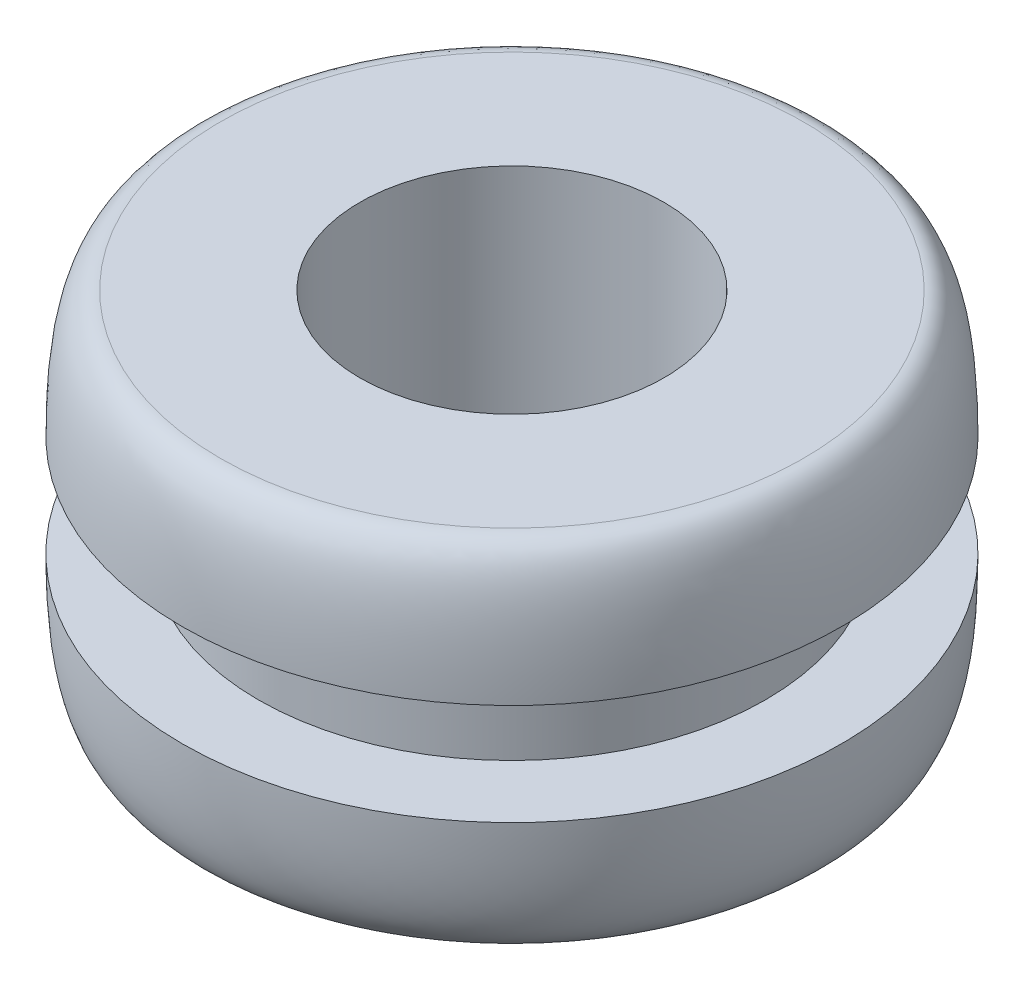
ISO-10303-21;
HEADER;
FILE_DESCRIPTION(('STEP AP214'),'2;1');
FILE_NAME('part.step','',(''),(''),'','','');
FILE_SCHEMA(('AUTOMOTIVE_DESIGN { 1 0 10303 214 1 1 1 1 }'));
ENDSEC;
DATA;
#1=APPLICATION_CONTEXT('core data for automotive mechanical design processes');
#2=APPLICATION_PROTOCOL_DEFINITION('international standard','automotive_design',2000,#1);
#3=PRODUCT_CONTEXT('',#1,'mechanical');
#4=PRODUCT('Part','Part','',(#3));
#5=PRODUCT_RELATED_PRODUCT_CATEGORY('part','',(#4));
#6=PRODUCT_DEFINITION_FORMATION('','',#4);
#7=PRODUCT_DEFINITION_CONTEXT('part definition',#1,'design');
#8=PRODUCT_DEFINITION('design','',#6,#7);
#9=PRODUCT_DEFINITION_SHAPE('','',#8);
#10=(LENGTH_UNIT() NAMED_UNIT(*) SI_UNIT(.MILLI.,.METRE.));
#11=(NAMED_UNIT(*) PLANE_ANGLE_UNIT() SI_UNIT($,.RADIAN.));
#12=(NAMED_UNIT(*) SI_UNIT($,.STERADIAN.) SOLID_ANGLE_UNIT());
#13=UNCERTAINTY_MEASURE_WITH_UNIT(LENGTH_MEASURE(1.E-05),#10,'distance_accuracy_value','');
#14=(GEOMETRIC_REPRESENTATION_CONTEXT(3) GLOBAL_UNCERTAINTY_ASSIGNED_CONTEXT((#13)) GLOBAL_UNIT_ASSIGNED_CONTEXT((#10,
#11,#12)) REPRESENTATION_CONTEXT('',''));
#15=CARTESIAN_POINT('',(0.,0.,0.));
#16=DIRECTION('',(0.,0.,1.));
#17=DIRECTION('',(1.,0.,0.));
#18=AXIS2_PLACEMENT_3D('',#15,#16,#17);
#19=CARTESIAN_POINT('',(-2.38125,2.778125,0.));
#20=DIRECTION('',(0.,1.,0.));
#21=DIRECTION('',(0.,0.,1.));
#22=AXIS2_PLACEMENT_3D('',#19,#20,#21);
#23=PLANE('',#22);
#24=CARTESIAN_POINT('',(0.,2.77812499999999,0.));
#25=DIRECTION('',(0.,1.,0.));
#26=DIRECTION('',(0.,0.,1.));
#27=AXIS2_PLACEMENT_3D('',#24,#25,#26);
#28=CIRCLE('',#27,4.5640625);
#29=CARTESIAN_POINT('',(0.,2.77812499999999,4.5640625));
#30=VERTEX_POINT('',#29);
#31=EDGE_CURVE('E63',#30,#30,#28,.T.);
#32=ORIENTED_EDGE('',*,*,#31,.T.);
#33=EDGE_LOOP('',(#32));
#34=FACE_BOUND('',#33,.T.);
#35=CARTESIAN_POINT('',(0.,2.77812500000001,0.));
#36=DIRECTION('',(0.,1.,0.));
#37=DIRECTION('',(0.,0.,1.));
#38=AXIS2_PLACEMENT_3D('',#35,#36,#37);
#39=CIRCLE('',#38,2.38125);
#40=CARTESIAN_POINT('',(0.,2.77812500000001,2.38125));
#41=VERTEX_POINT('',#40);
#42=EDGE_CURVE('E10',#41,#41,#39,.T.);
#43=ORIENTED_EDGE('',*,*,#42,.F.);
#44=EDGE_LOOP('',(#43));
#45=FACE_BOUND('',#44,.T.);
#46=ADVANCED_FACE('F35',(#34,#45),#23,.T.);
#47=CARTESIAN_POINT('',(0.,96.2646314073627,0.));
#48=DIRECTION('',(0.,1.,0.));
#49=DIRECTION('',(0.,0.,1.));
#50=AXIS2_PLACEMENT_3D('',#47,#48,#49);
#51=CYLINDRICAL_SURFACE('',#50,2.38125);
#52=ORIENTED_EDGE('',*,*,#42,.T.);
#53=EDGE_LOOP('',(#52));
#54=FACE_BOUND('',#53,.T.);
#55=CARTESIAN_POINT('',(0.,-2.77812500000001,0.));
#56=DIRECTION('',(0.,1.,0.));
#57=DIRECTION('',(0.,0.,1.));
#58=AXIS2_PLACEMENT_3D('',#55,#56,#57);
#59=CIRCLE('',#58,2.38125);
#60=CARTESIAN_POINT('',(0.,-2.77812500000001,2.38125));
#61=VERTEX_POINT('',#60);
#62=EDGE_CURVE('E41',#61,#61,#59,.T.);
#63=ORIENTED_EDGE('',*,*,#62,.F.);
#64=EDGE_LOOP('',(#63));
#65=FACE_BOUND('',#64,.T.);
#66=ADVANCED_FACE('F86',(#54,#65),#51,.F.);
#67=CARTESIAN_POINT('',(-2.38125,-2.778125,0.));
#68=DIRECTION('',(0.,-1.,0.));
#69=DIRECTION('',(0.,0.,-1.));
#70=AXIS2_PLACEMENT_3D('',#67,#68,#69);
#71=PLANE('',#70);
#72=ORIENTED_EDGE('',*,*,#62,.T.);
#73=EDGE_LOOP('',(#72));
#74=FACE_BOUND('',#73,.T.);
#75=CARTESIAN_POINT('',(0.,-2.77812500000001,0.));
#76=DIRECTION('',(0.,1.,0.));
#77=DIRECTION('',(0.,0.,1.));
#78=AXIS2_PLACEMENT_3D('',#75,#76,#77);
#79=CIRCLE('',#78,4.5640625);
#80=CARTESIAN_POINT('',(0.,-2.77812500000001,4.5640625));
#81=VERTEX_POINT('',#80);
#82=EDGE_CURVE('E45',#81,#81,#79,.T.);
#83=ORIENTED_EDGE('',*,*,#82,.F.);
#84=EDGE_LOOP('',(#83));
#85=FACE_BOUND('',#84,.T.);
#86=ADVANCED_FACE('F82',(#74,#85),#71,.T.);
#87=CARTESIAN_POINT('',(-5.15937500000053,-0.793749999999998,0.));
#88=CARTESIAN_POINT('',(-5.15937500000053,-1.8328323307605,0.));
#89=CARTESIAN_POINT('',(-5.04242434753371,-2.778125,0.));
#90=CARTESIAN_POINT('',(-4.5640625,-2.778125,0.));
#91=B_SPLINE_CURVE_WITH_KNOTS('',3,(#87,#88,#89,#90),.UNSPECIFIED.,.F.,.F.,(4,4),(0.,1.),.UNSPECIFIED.);
#92=CARTESIAN_POINT('',(0.,96.2646314073627,0.));
#93=DIRECTION('',(0.,1.,0.));
#94=AXIS1_PLACEMENT('',#92,#93);
#95=SURFACE_OF_REVOLUTION('',#91,#94);
#96=ORIENTED_EDGE('',*,*,#82,.T.);
#97=EDGE_LOOP('',(#96));
#98=FACE_BOUND('',#97,.T.);
#99=CARTESIAN_POINT('',(0.,-0.793749999999996,0.));
#100=DIRECTION('',(0.,1.,0.));
#101=DIRECTION('',(0.,0.,1.));
#102=AXIS2_PLACEMENT_3D('',#99,#100,#101);
#103=CIRCLE('',#102,5.15937500000053);
#104=CARTESIAN_POINT('',(0.,-0.793749999999996,5.15937500000053));
#105=VERTEX_POINT('',#104);
#106=EDGE_CURVE('E49',#105,#105,#103,.T.);
#107=ORIENTED_EDGE('',*,*,#106,.F.);
#108=EDGE_LOOP('',(#107));
#109=FACE_BOUND('',#108,.T.);
#110=ADVANCED_FACE('F77',(#98,#109),#95,.F.);
#111=CARTESIAN_POINT('',(-5.15937500000053,-0.79375,0.));
#112=DIRECTION('',(0.,1.,0.));
#113=DIRECTION('',(0.,0.,1.));
#114=AXIS2_PLACEMENT_3D('',#111,#112,#113);
#115=PLANE('',#114);
#116=ORIENTED_EDGE('',*,*,#106,.T.);
#117=EDGE_LOOP('',(#116));
#118=FACE_BOUND('',#117,.T.);
#119=CARTESIAN_POINT('',(0.,-0.793749999999996,0.));
#120=DIRECTION('',(0.,1.,0.));
#121=DIRECTION('',(0.,0.,1.));
#122=AXIS2_PLACEMENT_3D('',#119,#120,#121);
#123=CIRCLE('',#122,3.96874999999999);
#124=CARTESIAN_POINT('',(0.,-0.793749999999996,3.96874999999999));
#125=VERTEX_POINT('',#124);
#126=EDGE_CURVE('E54',#125,#125,#123,.T.);
#127=ORIENTED_EDGE('',*,*,#126,.F.);
#128=EDGE_LOOP('',(#127));
#129=FACE_BOUND('',#128,.T.);
#130=ADVANCED_FACE('F81',(#118,#129),#115,.T.);
#131=CARTESIAN_POINT('',(0.,96.2646314073627,0.));
#132=DIRECTION('',(0.,1.,0.));
#133=DIRECTION('',(0.,0.,1.));
#134=AXIS2_PLACEMENT_3D('',#131,#132,#133);
#135=CYLINDRICAL_SURFACE('',#134,3.96874999999999);
#136=ORIENTED_EDGE('',*,*,#126,.T.);
#137=EDGE_LOOP('',(#136));
#138=FACE_BOUND('',#137,.T.);
#139=CARTESIAN_POINT('',(0.,0.793749999999996,0.));
#140=DIRECTION('',(0.,1.,0.));
#141=DIRECTION('',(0.,0.,1.));
#142=AXIS2_PLACEMENT_3D('',#139,#140,#141);
#143=CIRCLE('',#142,3.96874999999999);
#144=CARTESIAN_POINT('',(0.,0.793749999999996,3.96874999999999));
#145=VERTEX_POINT('',#144);
#146=EDGE_CURVE('E57',#145,#145,#143,.T.);
#147=ORIENTED_EDGE('',*,*,#146,.F.);
#148=EDGE_LOOP('',(#147));
#149=FACE_BOUND('',#148,.T.);
#150=ADVANCED_FACE('F106',(#138,#149),#135,.T.);
#151=CARTESIAN_POINT('',(-5.15937500000062,0.79375,0.));
#152=DIRECTION('',(0.,-1.,0.));
#153=DIRECTION('',(0.,0.,-1.));
#154=AXIS2_PLACEMENT_3D('',#151,#152,#153);
#155=PLANE('',#154);
#156=ORIENTED_EDGE('',*,*,#146,.T.);
#157=EDGE_LOOP('',(#156));
#158=FACE_BOUND('',#157,.T.);
#159=CARTESIAN_POINT('',(0.,0.793749999999996,0.));
#160=DIRECTION('',(0.,1.,0.));
#161=DIRECTION('',(0.,0.,1.));
#162=AXIS2_PLACEMENT_3D('',#159,#160,#161);
#163=CIRCLE('',#162,5.15937500000062);
#164=CARTESIAN_POINT('',(0.,0.793749999999996,5.15937500000062));
#165=VERTEX_POINT('',#164);
#166=EDGE_CURVE('E60',#165,#165,#163,.T.);
#167=ORIENTED_EDGE('',*,*,#166,.F.);
#168=EDGE_LOOP('',(#167));
#169=FACE_BOUND('',#168,.T.);
#170=ADVANCED_FACE('F100',(#158,#169),#155,.T.);
#171=CARTESIAN_POINT('',(-4.5640625,2.778125,0.));
#172=CARTESIAN_POINT('',(-5.04242434753371,2.778125,0.));
#173=CARTESIAN_POINT('',(-5.15937500000062,1.8328323307605,0.));
#174=CARTESIAN_POINT('',(-5.15937500000062,0.793749999999998,0.));
#175=B_SPLINE_CURVE_WITH_KNOTS('',3,(#171,#172,#173,#174),.UNSPECIFIED.,.F.,.F.,(4,4),(0.,1.),.UNSPECIFIED.);
#176=CARTESIAN_POINT('',(0.,96.2646314073627,0.));
#177=DIRECTION('',(0.,1.,0.));
#178=AXIS1_PLACEMENT('',#176,#177);
#179=SURFACE_OF_REVOLUTION('',#175,#178);
#180=ORIENTED_EDGE('',*,*,#166,.T.);
#181=EDGE_LOOP('',(#180));
#182=FACE_BOUND('',#181,.T.);
#183=ORIENTED_EDGE('',*,*,#31,.F.);
#184=EDGE_LOOP('',(#183));
#185=FACE_BOUND('',#184,.T.);
#186=ADVANCED_FACE('F98',(#182,#185),#179,.F.);
#187=CLOSED_SHELL('',(#46,#66,#86,#110,#130,#150,#170,#186));
#188=MANIFOLD_SOLID_BREP('B2',#187);
#189=ADVANCED_BREP_SHAPE_REPRESENTATION('',(#18,#188),#14);
#190=SHAPE_DEFINITION_REPRESENTATION(#9,#189);
ENDSEC;
END-ISO-10303-21;
